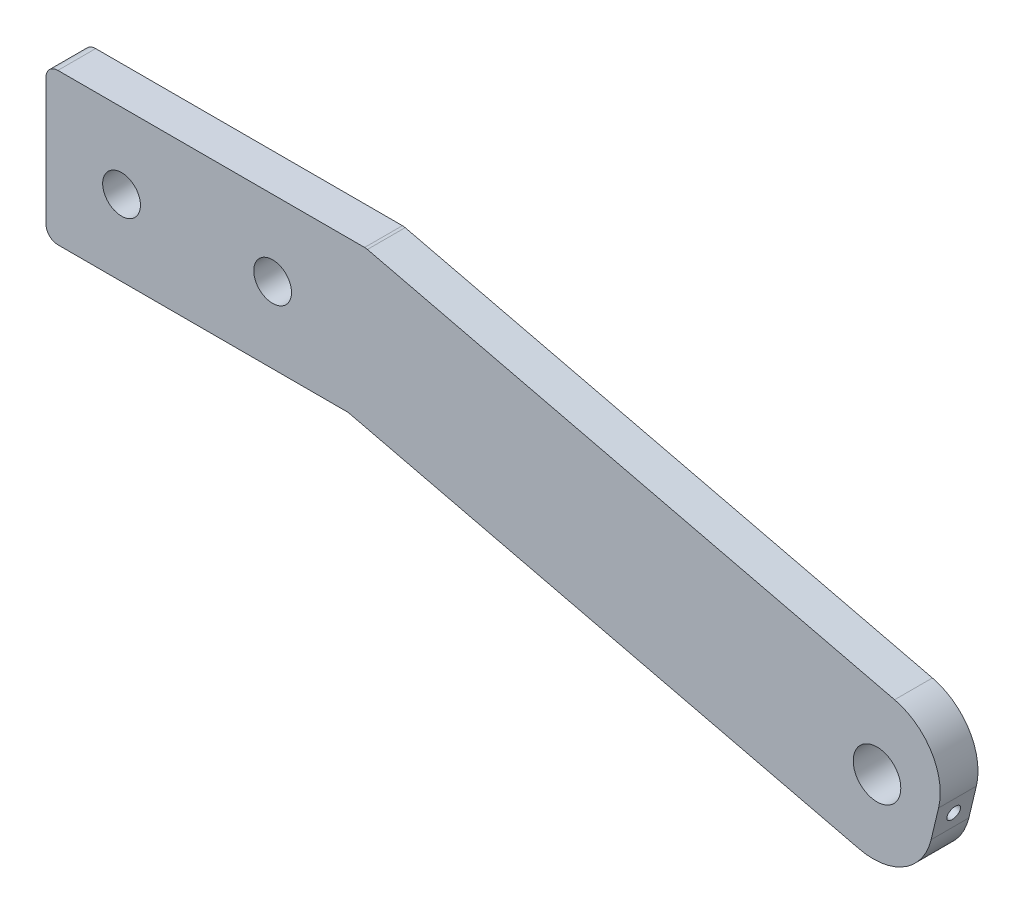
ISO-10303-21;
HEADER;
FILE_DESCRIPTION(('STEP AP214'),'2;1');
FILE_NAME('part.step','',(''),(''),'','','');
FILE_SCHEMA(('AUTOMOTIVE_DESIGN { 1 0 10303 214 1 1 1 1 }'));
ENDSEC;
DATA;
#1=APPLICATION_CONTEXT('core data for automotive mechanical design processes');
#2=APPLICATION_PROTOCOL_DEFINITION('international standard','automotive_design',2000,#1);
#3=PRODUCT_CONTEXT('',#1,'mechanical');
#4=PRODUCT('Part','Part','',(#3));
#5=PRODUCT_RELATED_PRODUCT_CATEGORY('part','',(#4));
#6=PRODUCT_DEFINITION_FORMATION('','',#4);
#7=PRODUCT_DEFINITION_CONTEXT('part definition',#1,'design');
#8=PRODUCT_DEFINITION('design','',#6,#7);
#9=PRODUCT_DEFINITION_SHAPE('','',#8);
#10=(LENGTH_UNIT() NAMED_UNIT(*) SI_UNIT(.MILLI.,.METRE.));
#11=(NAMED_UNIT(*) PLANE_ANGLE_UNIT() SI_UNIT($,.RADIAN.));
#12=(NAMED_UNIT(*) SI_UNIT($,.STERADIAN.) SOLID_ANGLE_UNIT());
#13=UNCERTAINTY_MEASURE_WITH_UNIT(LENGTH_MEASURE(1.E-05),#10,'distance_accuracy_value','');
#14=(GEOMETRIC_REPRESENTATION_CONTEXT(3) GLOBAL_UNCERTAINTY_ASSIGNED_CONTEXT((#13)) GLOBAL_UNIT_ASSIGNED_CONTEXT((#10,
#11,#12)) REPRESENTATION_CONTEXT('',''));
#15=CARTESIAN_POINT('',(0.,0.,0.));
#16=DIRECTION('',(0.,0.,1.));
#17=DIRECTION('',(1.,0.,0.));
#18=AXIS2_PLACEMENT_3D('',#15,#16,#17);
#19=CARTESIAN_POINT('',(0.,0.,6.35));
#20=DIRECTION('',(0.,0.,-1.));
#21=DIRECTION('',(-1.,0.,0.));
#22=AXIS2_PLACEMENT_3D('',#19,#20,#21);
#23=PLANE('',#22);
#24=DIRECTION('',(0.972452386669659,-0.233101599437848,0.));
#25=VECTOR('',#24,1.);
#26=CARTESIAN_POINT('',(12.7,-12.7,6.35));
#27=LINE('',#26,#25);
#28=CARTESIAN_POINT('',(12.9298460619296,-12.7550952266607,6.35));
#29=VERTEX_POINT('',#28);
#30=CARTESIAN_POINT('',(98.6396096871393,-33.3001453107047,6.35));
#31=VERTEX_POINT('',#30);
#32=EDGE_CURVE('E140',#29,#31,#27,.T.);
#33=ORIENTED_EDGE('',*,*,#32,.T.);
#34=CARTESIAN_POINT('',(100.970625681518,-23.5756214440081,6.35));
#35=DIRECTION('',(0.,0.,-1.));
#36=DIRECTION('',(-1.,0.,0.));
#37=AXIS2_PLACEMENT_3D('',#34,#35,#36);
#38=CIRCLE('',#37,10.);
#39=CARTESIAN_POINT('',(110.695149548214,-25.9066374383866,6.35));
#40=VERTEX_POINT('',#39);
#41=EDGE_CURVE('E41',#31,#40,#38,.F.);
#42=ORIENTED_EDGE('',*,*,#41,.T.);
#43=DIRECTION('',(0.233101599437848,0.97245238666966,0.));
#44=VECTOR('',#43,1.);
#45=CARTESIAN_POINT('',(108.364133553836,-35.6311613050832,6.35));
#46=LINE('',#45,#44);
#47=CARTESIAN_POINT('',(111.953898185179,-20.6553945503704,6.35));
#48=VERTEX_POINT('',#47);
#49=EDGE_CURVE('E147',#40,#48,#46,.T.);
#50=ORIENTED_EDGE('',*,*,#49,.T.);
#51=CARTESIAN_POINT('',(102.229374318482,-18.3243785559919,6.35));
#52=DIRECTION('',(0.,0.,-1.));
#53=DIRECTION('',(-1.,0.,0.));
#54=AXIS2_PLACEMENT_3D('',#51,#52,#53);
#55=CIRCLE('',#54,10.);
#56=CARTESIAN_POINT('',(104.560390312861,-8.5998546892953,6.35));
#57=VERTEX_POINT('',#56);
#58=EDGE_CURVE('E48',#48,#57,#55,.F.);
#59=ORIENTED_EDGE('',*,*,#58,.T.);
#60=DIRECTION('',(-0.972452386669659,0.233101599437848,0.));
#61=VECTOR('',#60,1.);
#62=CARTESIAN_POINT('',(15.7017356392152,12.7,6.35));
#63=LINE('',#62,#61);
#64=CARTESIAN_POINT('',(15.9315817011448,12.6449047733393,6.35));
#65=VERTEX_POINT('',#64);
#66=EDGE_CURVE('E150',#57,#65,#63,.T.);
#67=ORIENTED_EDGE('',*,*,#66,.T.);
#68=CARTESIAN_POINT('',(15.4653785022691,10.7,6.35));
#69=DIRECTION('',(0.,0.,-1.));
#70=DIRECTION('',(-1.,0.,0.));
#71=AXIS2_PLACEMENT_3D('',#68,#69,#70);
#72=CIRCLE('',#71,2.);
#73=CARTESIAN_POINT('',(15.4653785022691,12.7,6.35));
#74=VERTEX_POINT('',#73);
#75=EDGE_CURVE('E178',#65,#74,#72,.F.);
#76=ORIENTED_EDGE('',*,*,#75,.T.);
#77=DIRECTION('',(-1.,0.,0.));
#78=VECTOR('',#77,1.);
#79=CARTESIAN_POINT('',(15.7017356392152,12.7,6.35));
#80=LINE('',#79,#78);
#81=CARTESIAN_POINT('',(-36.1,12.7,6.35));
#82=VERTEX_POINT('',#81);
#83=EDGE_CURVE('E268',#74,#82,#80,.T.);
#84=ORIENTED_EDGE('',*,*,#83,.T.);
#85=CARTESIAN_POINT('',(-36.1,10.7,6.35));
#86=DIRECTION('',(0.,0.,-1.));
#87=DIRECTION('',(-1.,0.,0.));
#88=AXIS2_PLACEMENT_3D('',#85,#86,#87);
#89=CIRCLE('',#88,2.);
#90=CARTESIAN_POINT('',(-38.1,10.7,6.35));
#91=VERTEX_POINT('',#90);
#92=EDGE_CURVE('E174',#82,#91,#89,.F.);
#93=ORIENTED_EDGE('',*,*,#92,.T.);
#94=DIRECTION('',(0.,-1.,0.));
#95=VECTOR('',#94,1.);
#96=CARTESIAN_POINT('',(-38.1,-12.7,6.35));
#97=LINE('',#96,#95);
#98=CARTESIAN_POINT('',(-38.1,-10.7,6.35));
#99=VERTEX_POINT('',#98);
#100=EDGE_CURVE('E265',#91,#99,#97,.T.);
#101=ORIENTED_EDGE('',*,*,#100,.T.);
#102=CARTESIAN_POINT('',(-36.1,-10.7,6.35));
#103=DIRECTION('',(0.,0.,-1.));
#104=DIRECTION('',(-1.,0.,0.));
#105=AXIS2_PLACEMENT_3D('',#102,#103,#104);
#106=CIRCLE('',#105,2.);
#107=CARTESIAN_POINT('',(-36.1,-12.7,6.35));
#108=VERTEX_POINT('',#107);
#109=EDGE_CURVE('E176',#99,#108,#106,.F.);
#110=ORIENTED_EDGE('',*,*,#109,.T.);
#111=DIRECTION('',(1.,0.,0.));
#112=VECTOR('',#111,1.);
#113=CARTESIAN_POINT('',(12.7,-12.7,6.35));
#114=LINE('',#113,#112);
#115=CARTESIAN_POINT('',(12.4636428630539,-12.7,6.35));
#116=VERTEX_POINT('',#115);
#117=EDGE_CURVE('E263',#108,#116,#114,.T.);
#118=ORIENTED_EDGE('',*,*,#117,.T.);
#119=CARTESIAN_POINT('',(12.4636428630539,-14.7,6.35));
#120=DIRECTION('',(0.,0.,-1.));
#121=DIRECTION('',(-1.,0.,0.));
#122=AXIS2_PLACEMENT_3D('',#119,#120,#121);
#123=CIRCLE('',#122,2.);
#124=EDGE_CURVE('E135',#116,#29,#123,.T.);
#125=ORIENTED_EDGE('',*,*,#124,.T.);
#126=EDGE_LOOP('',(#33,#42,#50,#59,#67,#76,#84,#93,#101,#110,#118,#125));
#127=FACE_BOUND('',#126,.T.);
#128=CARTESIAN_POINT('',(101.6,-20.95,6.35));
#129=DIRECTION('',(0.,0.,1.));
#130=DIRECTION('',(1.,0.,0.));
#131=AXIS2_PLACEMENT_3D('',#128,#129,#130);
#132=CIRCLE('',#131,4.00000000000001);
#133=CARTESIAN_POINT('',(105.6,-20.95,6.35));
#134=VERTEX_POINT('',#133);
#135=EDGE_CURVE('E275',#134,#134,#132,.T.);
#136=ORIENTED_EDGE('',*,*,#135,.F.);
#137=EDGE_LOOP('',(#136));
#138=FACE_BOUND('',#137,.T.);
#139=CARTESIAN_POINT('',(-25.4,0.,6.35));
#140=DIRECTION('',(0.,0.,1.));
#141=DIRECTION('',(1.,0.,0.));
#142=AXIS2_PLACEMENT_3D('',#139,#140,#141);
#143=CIRCLE('',#142,3.175);
#144=CARTESIAN_POINT('',(-22.225,0.,6.35));
#145=VERTEX_POINT('',#144);
#146=EDGE_CURVE('E294',#145,#145,#143,.T.);
#147=ORIENTED_EDGE('',*,*,#146,.F.);
#148=EDGE_LOOP('',(#147));
#149=FACE_BOUND('',#148,.T.);
#150=CARTESIAN_POINT('',(0.,0.,6.35));
#151=DIRECTION('',(0.,0.,1.));
#152=DIRECTION('',(1.,0.,0.));
#153=AXIS2_PLACEMENT_3D('',#150,#151,#152);
#154=CIRCLE('',#153,3.175);
#155=CARTESIAN_POINT('',(3.175,0.,6.35));
#156=VERTEX_POINT('',#155);
#157=EDGE_CURVE('E300',#156,#156,#154,.T.);
#158=ORIENTED_EDGE('',*,*,#157,.F.);
#159=EDGE_LOOP('',(#158));
#160=FACE_BOUND('',#159,.T.);
#161=ADVANCED_FACE('F33',(#127,#138,#149,#160),#23,.F.);
#162=CARTESIAN_POINT('',(0.,0.,0.));
#163=DIRECTION('',(0.,0.,-1.));
#164=DIRECTION('',(-1.,0.,0.));
#165=AXIS2_PLACEMENT_3D('',#162,#163,#164);
#166=PLANE('',#165);
#167=CARTESIAN_POINT('',(-25.4,0.,0.));
#168=DIRECTION('',(0.,0.,1.));
#169=DIRECTION('',(1.,0.,0.));
#170=AXIS2_PLACEMENT_3D('',#167,#168,#169);
#171=CIRCLE('',#170,3.175);
#172=CARTESIAN_POINT('',(-22.225,0.,0.));
#173=VERTEX_POINT('',#172);
#174=EDGE_CURVE('E297',#173,#173,#171,.T.);
#175=ORIENTED_EDGE('',*,*,#174,.T.);
#176=EDGE_LOOP('',(#175));
#177=FACE_BOUND('',#176,.T.);
#178=DIRECTION('',(0.233101599437848,0.97245238666966,0.));
#179=VECTOR('',#178,1.);
#180=CARTESIAN_POINT('',(108.364133553836,-35.6311613050832,0.));
#181=LINE('',#180,#179);
#182=CARTESIAN_POINT('',(110.695149548214,-25.9066374383866,0.));
#183=VERTEX_POINT('',#182);
#184=CARTESIAN_POINT('',(111.953898185179,-20.6553945503704,0.));
#185=VERTEX_POINT('',#184);
#186=EDGE_CURVE('E272',#183,#185,#181,.T.);
#187=ORIENTED_EDGE('',*,*,#186,.F.);
#188=CARTESIAN_POINT('',(100.970625681518,-23.5756214440081,0.));
#189=DIRECTION('',(0.,0.,-1.));
#190=DIRECTION('',(-1.,0.,0.));
#191=AXIS2_PLACEMENT_3D('',#188,#189,#190);
#192=CIRCLE('',#191,10.);
#193=CARTESIAN_POINT('',(98.6396096871393,-33.3001453107047,0.));
#194=VERTEX_POINT('',#193);
#195=EDGE_CURVE('E146',#183,#194,#192,.T.);
#196=ORIENTED_EDGE('',*,*,#195,.T.);
#197=DIRECTION('',(0.972452386669659,-0.233101599437848,0.));
#198=VECTOR('',#197,1.);
#199=CARTESIAN_POINT('',(12.7,-12.7,0.));
#200=LINE('',#199,#198);
#201=CARTESIAN_POINT('',(12.9298460619296,-12.7550952266607,0.));
#202=VERTEX_POINT('',#201);
#203=EDGE_CURVE('E139',#202,#194,#200,.T.);
#204=ORIENTED_EDGE('',*,*,#203,.F.);
#205=CARTESIAN_POINT('',(12.4636428630539,-14.7,0.));
#206=DIRECTION('',(0.,0.,-1.));
#207=DIRECTION('',(-1.,0.,0.));
#208=AXIS2_PLACEMENT_3D('',#205,#206,#207);
#209=CIRCLE('',#208,2.);
#210=CARTESIAN_POINT('',(12.4636428630539,-12.7,0.));
#211=VERTEX_POINT('',#210);
#212=EDGE_CURVE('E125',#202,#211,#209,.F.);
#213=ORIENTED_EDGE('',*,*,#212,.T.);
#214=DIRECTION('',(1.,0.,0.));
#215=VECTOR('',#214,1.);
#216=CARTESIAN_POINT('',(12.7,-12.7,0.));
#217=LINE('',#216,#215);
#218=CARTESIAN_POINT('',(-36.1,-12.7,0.));
#219=VERTEX_POINT('',#218);
#220=EDGE_CURVE('E148',#219,#211,#217,.T.);
#221=ORIENTED_EDGE('',*,*,#220,.F.);
#222=CARTESIAN_POINT('',(-36.1,-10.7,0.));
#223=DIRECTION('',(0.,0.,-1.));
#224=DIRECTION('',(-1.,0.,0.));
#225=AXIS2_PLACEMENT_3D('',#222,#223,#224);
#226=CIRCLE('',#225,2.);
#227=CARTESIAN_POINT('',(-38.1,-10.7,0.));
#228=VERTEX_POINT('',#227);
#229=EDGE_CURVE('E166',#219,#228,#226,.T.);
#230=ORIENTED_EDGE('',*,*,#229,.T.);
#231=DIRECTION('',(0.,-1.,0.));
#232=VECTOR('',#231,1.);
#233=CARTESIAN_POINT('',(-38.1,-12.7,0.));
#234=LINE('',#233,#232);
#235=CARTESIAN_POINT('',(-38.1,10.7,0.));
#236=VERTEX_POINT('',#235);
#237=EDGE_CURVE('E152',#236,#228,#234,.T.);
#238=ORIENTED_EDGE('',*,*,#237,.F.);
#239=CARTESIAN_POINT('',(-36.1,10.7,0.));
#240=DIRECTION('',(0.,0.,-1.));
#241=DIRECTION('',(-1.,0.,0.));
#242=AXIS2_PLACEMENT_3D('',#239,#240,#241);
#243=CIRCLE('',#242,2.);
#244=CARTESIAN_POINT('',(-36.1,12.7,0.));
#245=VERTEX_POINT('',#244);
#246=EDGE_CURVE('E164',#236,#245,#243,.T.);
#247=ORIENTED_EDGE('',*,*,#246,.T.);
#248=DIRECTION('',(-1.,0.,0.));
#249=VECTOR('',#248,1.);
#250=CARTESIAN_POINT('',(15.7017356392152,12.7,0.));
#251=LINE('',#250,#249);
#252=CARTESIAN_POINT('',(15.4653785022691,12.7,0.));
#253=VERTEX_POINT('',#252);
#254=EDGE_CURVE('E277',#253,#245,#251,.T.);
#255=ORIENTED_EDGE('',*,*,#254,.F.);
#256=CARTESIAN_POINT('',(15.4653785022691,10.7,0.));
#257=DIRECTION('',(0.,0.,-1.));
#258=DIRECTION('',(-1.,0.,0.));
#259=AXIS2_PLACEMENT_3D('',#256,#257,#258);
#260=CIRCLE('',#259,2.);
#261=CARTESIAN_POINT('',(15.9315817011448,12.6449047733393,0.));
#262=VERTEX_POINT('',#261);
#263=EDGE_CURVE('E168',#253,#262,#260,.T.);
#264=ORIENTED_EDGE('',*,*,#263,.T.);
#265=DIRECTION('',(-0.972452386669659,0.233101599437848,0.));
#266=VECTOR('',#265,1.);
#267=CARTESIAN_POINT('',(15.7017356392152,12.7,0.));
#268=LINE('',#267,#266);
#269=CARTESIAN_POINT('',(104.560390312861,-8.5998546892953,0.));
#270=VERTEX_POINT('',#269);
#271=EDGE_CURVE('E274',#270,#262,#268,.T.);
#272=ORIENTED_EDGE('',*,*,#271,.F.);
#273=CARTESIAN_POINT('',(102.229374318482,-18.3243785559919,0.));
#274=DIRECTION('',(0.,0.,-1.));
#275=DIRECTION('',(-1.,0.,0.));
#276=AXIS2_PLACEMENT_3D('',#273,#274,#275);
#277=CIRCLE('',#276,10.);
#278=EDGE_CURVE('E190',#270,#185,#277,.T.);
#279=ORIENTED_EDGE('',*,*,#278,.T.);
#280=EDGE_LOOP('',(#187,#196,#204,#213,#221,#230,#238,#247,#255,#264,#272,#279));
#281=FACE_BOUND('',#280,.T.);
#282=CARTESIAN_POINT('',(101.6,-20.95,0.));
#283=DIRECTION('',(0.,0.,1.));
#284=DIRECTION('',(1.,0.,0.));
#285=AXIS2_PLACEMENT_3D('',#282,#283,#284);
#286=CIRCLE('',#285,4.00000000000001);
#287=CARTESIAN_POINT('',(105.6,-20.95,0.));
#288=VERTEX_POINT('',#287);
#289=EDGE_CURVE('E291',#288,#288,#286,.T.);
#290=ORIENTED_EDGE('',*,*,#289,.T.);
#291=EDGE_LOOP('',(#290));
#292=FACE_BOUND('',#291,.T.);
#293=CARTESIAN_POINT('',(0.,0.,0.));
#294=DIRECTION('',(0.,0.,1.));
#295=DIRECTION('',(1.,0.,0.));
#296=AXIS2_PLACEMENT_3D('',#293,#294,#295);
#297=CIRCLE('',#296,3.175);
#298=CARTESIAN_POINT('',(3.175,0.,0.));
#299=VERTEX_POINT('',#298);
#300=EDGE_CURVE('E303',#299,#299,#297,.T.);
#301=ORIENTED_EDGE('',*,*,#300,.T.);
#302=EDGE_LOOP('',(#301));
#303=FACE_BOUND('',#302,.T.);
#304=ADVANCED_FACE('F144',(#177,#281,#292,#303),#166,.T.);
#305=CARTESIAN_POINT('',(108.364133553836,-35.6311613050832,6.35));
#306=DIRECTION('',(-0.972452386669659,0.233101599437848,0.));
#307=DIRECTION('',(-0.233101599437848,-0.972452386669659,0.));
#308=AXIS2_PLACEMENT_3D('',#305,#306,#307);
#309=PLANE('',#308);
#310=CARTESIAN_POINT('',(111.324523866697,-23.2810159943785,3.175));
#311=DIRECTION('',(0.972452386669659,-0.233101599437848,0.));
#312=DIRECTION('',(0.233101599437848,0.972452386669659,0.));
#313=AXIS2_PLACEMENT_3D('',#310,#311,#312);
#314=CIRCLE('',#313,1.1303);
#315=CARTESIAN_POINT('',(111.587998604541,-22.1818530617258,3.175));
#316=VERTEX_POINT('',#315);
#317=EDGE_CURVE('E306',#316,#316,#314,.T.);
#318=ORIENTED_EDGE('',*,*,#317,.F.);
#319=EDGE_LOOP('',(#318));
#320=FACE_BOUND('',#319,.T.);
#321=ORIENTED_EDGE('',*,*,#49,.F.);
#322=DIRECTION('',(0.,0.,-1.));
#323=VECTOR('',#322,1.);
#324=CARTESIAN_POINT('',(110.695149548214,-25.9066374383866,6.35));
#325=LINE('',#324,#323);
#326=EDGE_CURVE('E187',#40,#183,#325,.T.);
#327=ORIENTED_EDGE('',*,*,#326,.T.);
#328=ORIENTED_EDGE('',*,*,#186,.T.);
#329=DIRECTION('',(0.,0.,-1.));
#330=VECTOR('',#329,1.);
#331=CARTESIAN_POINT('',(111.953898185179,-20.6553945503704,6.35));
#332=LINE('',#331,#330);
#333=EDGE_CURVE('E185',#185,#48,#332,.F.);
#334=ORIENTED_EDGE('',*,*,#333,.T.);
#335=EDGE_LOOP('',(#321,#327,#328,#334));
#336=FACE_BOUND('',#335,.T.);
#337=ADVANCED_FACE('F200',(#320,#336),#309,.F.);
#338=CARTESIAN_POINT('',(15.7017356392152,12.7,6.35));
#339=DIRECTION('',(-0.233101599437848,-0.972452386669659,0.));
#340=DIRECTION('',(0.97245238666966,-0.233101599437848,0.));
#341=AXIS2_PLACEMENT_3D('',#338,#339,#340);
#342=PLANE('',#341);
#343=ORIENTED_EDGE('',*,*,#66,.F.);
#344=DIRECTION('',(0.,0.,-1.));
#345=VECTOR('',#344,1.);
#346=CARTESIAN_POINT('',(104.560390312861,-8.5998546892953,6.35));
#347=LINE('',#346,#345);
#348=EDGE_CURVE('E11',#57,#270,#347,.T.);
#349=ORIENTED_EDGE('',*,*,#348,.T.);
#350=ORIENTED_EDGE('',*,*,#271,.T.);
#351=DIRECTION('',(0.,0.,-1.));
#352=VECTOR('',#351,1.);
#353=CARTESIAN_POINT('',(15.9315817011448,12.6449047733393,6.35));
#354=LINE('',#353,#352);
#355=EDGE_CURVE('E171',#262,#65,#354,.F.);
#356=ORIENTED_EDGE('',*,*,#355,.T.);
#357=EDGE_LOOP('',(#343,#349,#350,#356));
#358=FACE_BOUND('',#357,.T.);
#359=ADVANCED_FACE('F238',(#358),#342,.F.);
#360=CARTESIAN_POINT('',(15.7017356392152,12.7,6.35));
#361=DIRECTION('',(0.,-1.,0.));
#362=DIRECTION('',(1.,0.,0.));
#363=AXIS2_PLACEMENT_3D('',#360,#361,#362);
#364=PLANE('',#363);
#365=ORIENTED_EDGE('',*,*,#83,.F.);
#366=DIRECTION('',(0.,0.,-1.));
#367=VECTOR('',#366,1.);
#368=CARTESIAN_POINT('',(15.4653785022691,12.7,6.35));
#369=LINE('',#368,#367);
#370=EDGE_CURVE('E161',#74,#253,#369,.T.);
#371=ORIENTED_EDGE('',*,*,#370,.T.);
#372=ORIENTED_EDGE('',*,*,#254,.T.);
#373=DIRECTION('',(0.,0.,-1.));
#374=VECTOR('',#373,1.);
#375=CARTESIAN_POINT('',(-36.1,12.7,6.35));
#376=LINE('',#375,#374);
#377=EDGE_CURVE('E159',#245,#82,#376,.F.);
#378=ORIENTED_EDGE('',*,*,#377,.T.);
#379=EDGE_LOOP('',(#365,#371,#372,#378));
#380=FACE_BOUND('',#379,.T.);
#381=ADVANCED_FACE('F234',(#380),#364,.F.);
#382=CARTESIAN_POINT('',(-38.1,-12.7,6.35));
#383=DIRECTION('',(1.,0.,0.));
#384=DIRECTION('',(0.,0.,-1.));
#385=AXIS2_PLACEMENT_3D('',#382,#383,#384);
#386=PLANE('',#385);
#387=ORIENTED_EDGE('',*,*,#237,.T.);
#388=DIRECTION('',(0.,0.,-1.));
#389=VECTOR('',#388,1.);
#390=CARTESIAN_POINT('',(-38.1,-10.7,6.35));
#391=LINE('',#390,#389);
#392=EDGE_CURVE('E136',#228,#99,#391,.F.);
#393=ORIENTED_EDGE('',*,*,#392,.T.);
#394=ORIENTED_EDGE('',*,*,#100,.F.);
#395=DIRECTION('',(0.,0.,-1.));
#396=VECTOR('',#395,1.);
#397=CARTESIAN_POINT('',(-38.1,10.7,6.35));
#398=LINE('',#397,#396);
#399=EDGE_CURVE('E180',#91,#236,#398,.T.);
#400=ORIENTED_EDGE('',*,*,#399,.T.);
#401=EDGE_LOOP('',(#387,#393,#394,#400));
#402=FACE_BOUND('',#401,.T.);
#403=ADVANCED_FACE('F230',(#402),#386,.F.);
#404=CARTESIAN_POINT('',(12.7,-12.7,6.35));
#405=DIRECTION('',(0.,1.,0.));
#406=DIRECTION('',(-1.,0.,0.));
#407=AXIS2_PLACEMENT_3D('',#404,#405,#406);
#408=PLANE('',#407);
#409=ORIENTED_EDGE('',*,*,#220,.T.);
#410=DIRECTION('',(0.,0.,-1.));
#411=VECTOR('',#410,1.);
#412=CARTESIAN_POINT('',(12.4636428630539,-12.7,6.35));
#413=LINE('',#412,#411);
#414=EDGE_CURVE('E130',#211,#116,#413,.F.);
#415=ORIENTED_EDGE('',*,*,#414,.T.);
#416=ORIENTED_EDGE('',*,*,#117,.F.);
#417=DIRECTION('',(0.,0.,-1.));
#418=VECTOR('',#417,1.);
#419=CARTESIAN_POINT('',(-36.1,-12.7,6.35));
#420=LINE('',#419,#418);
#421=EDGE_CURVE('E141',#108,#219,#420,.T.);
#422=ORIENTED_EDGE('',*,*,#421,.T.);
#423=EDGE_LOOP('',(#409,#415,#416,#422));
#424=FACE_BOUND('',#423,.T.);
#425=ADVANCED_FACE('F227',(#424),#408,.F.);
#426=CARTESIAN_POINT('',(12.7,-12.7,6.35));
#427=DIRECTION('',(0.233101599437848,0.97245238666966,0.));
#428=DIRECTION('',(-0.97245238666966,0.233101599437848,0.));
#429=AXIS2_PLACEMENT_3D('',#426,#427,#428);
#430=PLANE('',#429);
#431=ORIENTED_EDGE('',*,*,#203,.T.);
#432=DIRECTION('',(0.,0.,-1.));
#433=VECTOR('',#432,1.);
#434=CARTESIAN_POINT('',(98.6396096871393,-33.3001453107047,6.35));
#435=LINE('',#434,#433);
#436=EDGE_CURVE('E56',#194,#31,#435,.F.);
#437=ORIENTED_EDGE('',*,*,#436,.T.);
#438=ORIENTED_EDGE('',*,*,#32,.F.);
#439=DIRECTION('',(0.,0.,-1.));
#440=VECTOR('',#439,1.);
#441=CARTESIAN_POINT('',(12.9298460619296,-12.7550952266607,0.));
#442=LINE('',#441,#440);
#443=EDGE_CURVE('E129',#29,#202,#442,.T.);
#444=ORIENTED_EDGE('',*,*,#443,.T.);
#445=EDGE_LOOP('',(#431,#437,#438,#444));
#446=FACE_BOUND('',#445,.T.);
#447=ADVANCED_FACE('F138',(#446),#430,.F.);
#448=CARTESIAN_POINT('',(101.6,-20.95,6.35));
#449=DIRECTION('',(0.,0.,-1.));
#450=DIRECTION('',(-1.,0.,0.));
#451=AXIS2_PLACEMENT_3D('',#448,#449,#450);
#452=CYLINDRICAL_SURFACE('',#451,4.00000000000001);
#453=CARTESIAN_POINT('',(105.594755906145,-20.7452434364466,3.175));
#454=CARTESIAN_POINT('',(105.594756514688,-20.7452448037348,3.23711372815392));
#455=CARTESIAN_POINT('',(105.595041112031,-20.750594803155,3.29923954462562));
#456=CARTESIAN_POINT('',(105.596041153498,-20.7717754541651,3.42168671853409));
#457=CARTESIAN_POINT('',(105.596756779677,-20.7876105346594,3.48200730218087));
#458=CARTESIAN_POINT('',(105.598225933012,-20.8291026222887,3.5990545029817));
#459=CARTESIAN_POINT('',(105.598979400884,-20.8547446585494,3.65578644531423));
#460=CARTESIAN_POINT('',(105.59995922102,-20.9149444714095,3.76430253358386));
#461=CARTESIAN_POINT('',(105.600185514254,-20.9495032459511,3.81608612482261));
#462=CARTESIAN_POINT('',(105.599444566683,-21.0274339364745,3.91468945323319));
#463=CARTESIAN_POINT('',(105.598446861735,-21.0710074242587,3.96134968479979));
#464=CARTESIAN_POINT('',(105.594489874456,-21.1650912679575,4.04696683188998));
#465=CARTESIAN_POINT('',(105.591530367213,-21.2156024187126,4.08592286350243));
#466=CARTESIAN_POINT('',(105.582933663313,-21.3230870185405,4.15570363256051));
#467=CARTESIAN_POINT('',(105.577248829967,-21.3801611396259,4.18636791111128));
#468=CARTESIAN_POINT('',(105.5626912949,-21.498281917821,4.23764503052909));
#469=CARTESIAN_POINT('',(105.553819200225,-21.5593278166533,4.25825978366995));
#470=CARTESIAN_POINT('',(105.532948913398,-21.6818997434694,4.28833106320461));
#471=CARTESIAN_POINT('',(105.521036432702,-21.7433736050195,4.2980593602554));
#472=CARTESIAN_POINT('',(105.494119555027,-21.8664032484297,4.30693861015676));
#473=CARTESIAN_POINT('',(105.479115737137,-21.9279590128046,4.30609154228602));
#474=CARTESIAN_POINT('',(105.446954353631,-22.0475755928286,4.2940313447407));
#475=CARTESIAN_POINT('',(105.429869723732,-22.1056860160085,4.28311214290585));
#476=CARTESIAN_POINT('',(105.393938820406,-22.2186784951625,4.25169492574781));
#477=CARTESIAN_POINT('',(105.375092440886,-22.2735603563876,4.23119633325501));
#478=CARTESIAN_POINT('',(105.336340428917,-22.3793247980597,4.18098928170668));
#479=CARTESIAN_POINT('',(105.316425572436,-22.4301579250884,4.15118398425996));
#480=CARTESIAN_POINT('',(105.276791707388,-22.5260387726938,4.08328490579975));
#481=CARTESIAN_POINT('',(105.257072741912,-22.571085245282,4.04518934160868));
#482=CARTESIAN_POINT('',(105.218308907267,-22.6558990543721,3.96024709838253));
#483=CARTESIAN_POINT('',(105.199310466867,-22.6954318735083,3.91314474808012));
#484=CARTESIAN_POINT('',(105.163995549803,-22.7664562371411,3.81232521005738));
#485=CARTESIAN_POINT('',(105.147679281028,-22.7979471584319,3.75860751015933));
#486=CARTESIAN_POINT('',(105.118805174291,-22.852359171085,3.64551320522094));
#487=CARTESIAN_POINT('',(105.106277081613,-22.8752127735587,3.58609640689279));
#488=CARTESIAN_POINT('',(105.08617369406,-22.9113837016121,3.46363524335901));
#489=CARTESIAN_POINT('',(105.078596994769,-22.9247037314021,3.40059191230995));
#490=CARTESIAN_POINT('',(105.069217405298,-22.9411347827603,3.274919846487));
#491=CARTESIAN_POINT('',(105.067230440186,-22.9445713632737,3.21234736384443));
#492=CARTESIAN_POINT('',(105.068671965706,-22.942063538483,3.08745859327182));
#493=CARTESIAN_POINT('',(105.072099797975,-22.9361202736382,3.02514227511933));
#494=CARTESIAN_POINT('',(105.083942100436,-22.9152695258045,2.90397208572161));
#495=CARTESIAN_POINT('',(105.092243880481,-22.9005645116173,2.84507202008121));
#496=CARTESIAN_POINT('',(105.113097387747,-22.8627493145555,2.73083295295429));
#497=CARTESIAN_POINT('',(105.125649718665,-22.839637937709,2.67549445863935));
#498=CARTESIAN_POINT('',(105.154454471913,-22.7848922376243,2.56846474448139));
#499=CARTESIAN_POINT('',(105.170789345265,-22.753064571577,2.5168947294188));
#500=CARTESIAN_POINT('',(105.20586586851,-22.6818498463105,2.4201876105872));
#501=CARTESIAN_POINT('',(105.224608028075,-22.6424611853925,2.37505187337337));
#502=CARTESIAN_POINT('',(105.263966996011,-22.5555194420151,2.29096531809175));
#503=CARTESIAN_POINT('',(105.284625216879,-22.5077401825652,2.25226717156375));
#504=CARTESIAN_POINT('',(105.325980721527,-22.4060480692528,2.18402395836973));
#505=CARTESIAN_POINT('',(105.346678003193,-22.3521355382799,2.15447841016448));
#506=CARTESIAN_POINT('',(105.386764534888,-22.2399350020793,2.10565983065959));
#507=CARTESIAN_POINT('',(105.406162669571,-22.1816840949706,2.0863090559791));
#508=CARTESIAN_POINT('',(105.4428213995,-22.0620400172536,2.05821412396092));
#509=CARTESIAN_POINT('',(105.460082530613,-22.0006476398676,2.04946730276015));
#510=CARTESIAN_POINT('',(105.491190229498,-21.8786894390104,2.04301225405897));
#511=CARTESIAN_POINT('',(105.505133661047,-21.8181675709229,2.0449354508621));
#512=CARTESIAN_POINT('',(105.5299829917,-21.6976749455243,2.05889832229464));
#513=CARTESIAN_POINT('',(105.540889030727,-21.6377041629494,2.07093753080828));
#514=CARTESIAN_POINT('',(105.55953717129,-21.5205748296191,2.10457254114808));
#515=CARTESIAN_POINT('',(105.567305601346,-21.4633965738546,2.12608551097358));
#516=CARTESIAN_POINT('',(105.580047694889,-21.3528869993989,2.17798370573449));
#517=CARTESIAN_POINT('',(105.585020931685,-21.2995562691241,2.20837028417184));
#518=CARTESIAN_POINT('',(105.592728718252,-21.1966927408138,2.27818632675747));
#519=CARTESIAN_POINT('',(105.595393572081,-21.1473165491379,2.31785418117005));
#520=CARTESIAN_POINT('',(105.598871451747,-21.055547663434,2.40466532241355));
#521=CARTESIAN_POINT('',(105.599683969448,-21.0131568886145,2.45181065668607));
#522=CARTESIAN_POINT('',(105.600167194586,-20.9356538169672,2.55368500090855));
#523=CARTESIAN_POINT('',(105.599808224108,-20.900754952542,2.60857688454948));
#524=CARTESIAN_POINT('',(105.59862406815,-20.8408756230978,2.72350589295951));
#525=CARTESIAN_POINT('',(105.5977991519,-20.8158894445698,2.78354002948333));
#526=CARTESIAN_POINT('',(105.596399758422,-20.7794938067301,2.89851693538745));
#527=CARTESIAN_POINT('',(105.595806433673,-20.7666875779435,2.95302070659744));
#528=CARTESIAN_POINT('',(105.594984261309,-20.7495624133854,3.06334652864946));
#529=CARTESIAN_POINT('',(105.59475535915,-20.7452422074443,3.11916838093795));
#530=CARTESIAN_POINT('',(105.594755906145,-20.7452434364466,3.175));
#531=B_SPLINE_CURVE_WITH_KNOTS('',3,(#453,#454,#455,#456,#457,#458,#459,#460,#461,#462,#463,
#464,#465,#466,#467,#468,#469,#470,#471,#472,#473,#474,#475,#476,#477,#478,#479,#480,#481,#482,
#483,#484,#485,#486,#487,#488,#489,#490,#491,#492,#493,#494,#495,#496,#497,#498,#499,#500,#501,
#502,#503,#504,#505,#506,#507,#508,#509,#510,#511,#512,#513,#514,#515,#516,#517,#518,#519,#520,
#521,#522,#523,#524,#525,#526,#527,#528,#529,#530),.UNSPECIFIED.,.T.,.F.,(4,2,2,2,2,2,2,2,2,2,2,
2,2,2,2,2,2,2,2,2,2,2,2,2,2,2,2,2,2,2,2,2,2,2,2,2,2,2,4),(0.,0.186135589509668,
0.372349853000611,0.558280977223397,0.744232919492104,0.934908408617409,1.12560576147091,
1.31976512856389,1.51388753560898,1.70304751535099,1.89217209256027,2.07594644403613,
2.25973186956171,2.44549720530417,2.63130253741552,2.82349089718013,3.01569414603705,
3.20936959200039,3.4029900798797,3.59015533205527,3.7772978292814,3.96027493252019,
4.14327803450554,4.33072519990161,4.51821211746174,4.71187415927933,4.90552601036089,
5.09767891516587,5.28978353843416,5.4752945105866,5.6607969354136,5.84470869666109,
6.02864852485081,6.21796564305166,6.40733468878239,6.60153799259508,6.79562919762533,
6.96296430175573,7.13027435762039),.UNSPECIFIED.);
#532=CARTESIAN_POINT('',(105.594755906145,-20.7452434364466,3.175));
#533=VERTEX_POINT('',#532);
#534=EDGE_CURVE('E311',#533,#533,#531,.T.);
#535=ORIENTED_EDGE('',*,*,#534,.T.);
#536=EDGE_LOOP('',(#535));
#537=FACE_BOUND('',#536,.T.);
#538=ORIENTED_EDGE('',*,*,#135,.T.);
#539=EDGE_LOOP('',(#538));
#540=FACE_BOUND('',#539,.T.);
#541=ORIENTED_EDGE('',*,*,#289,.F.);
#542=EDGE_LOOP('',(#541));
#543=FACE_BOUND('',#542,.T.);
#544=ADVANCED_FACE('F222',(#537,#540,#543),#452,.F.);
#545=CARTESIAN_POINT('',(-25.4,0.,6.35));
#546=DIRECTION('',(0.,0.,-1.));
#547=DIRECTION('',(-1.,0.,0.));
#548=AXIS2_PLACEMENT_3D('',#545,#546,#547);
#549=CYLINDRICAL_SURFACE('',#548,3.175);
#550=ORIENTED_EDGE('',*,*,#146,.T.);
#551=EDGE_LOOP('',(#550));
#552=FACE_BOUND('',#551,.T.);
#553=ORIENTED_EDGE('',*,*,#174,.F.);
#554=EDGE_LOOP('',(#553));
#555=FACE_BOUND('',#554,.T.);
#556=ADVANCED_FACE('F323',(#552,#555),#549,.F.);
#557=CARTESIAN_POINT('',(0.,0.,6.35));
#558=DIRECTION('',(0.,0.,-1.));
#559=DIRECTION('',(-1.,0.,0.));
#560=AXIS2_PLACEMENT_3D('',#557,#558,#559);
#561=CYLINDRICAL_SURFACE('',#560,3.175);
#562=ORIENTED_EDGE('',*,*,#157,.T.);
#563=EDGE_LOOP('',(#562));
#564=FACE_BOUND('',#563,.T.);
#565=ORIENTED_EDGE('',*,*,#300,.F.);
#566=EDGE_LOOP('',(#565));
#567=FACE_BOUND('',#566,.T.);
#568=ADVANCED_FACE('F321',(#564,#567),#561,.F.);
#569=CARTESIAN_POINT('',(-38.138172413868,12.5459242619037,3.175));
#570=DIRECTION('',(0.97245238666966,-0.233101599437848,0.));
#571=DIRECTION('',(0.233101599437848,0.97245238666966,0.));
#572=AXIS2_PLACEMENT_3D('',#569,#570,#571);
#573=CYLINDRICAL_SURFACE('',#572,1.1303);
#574=ORIENTED_EDGE('',*,*,#534,.F.);
#575=EDGE_LOOP('',(#574));
#576=FACE_BOUND('',#575,.T.);
#577=ORIENTED_EDGE('',*,*,#317,.T.);
#578=EDGE_LOOP('',(#577));
#579=FACE_BOUND('',#578,.T.);
#580=ADVANCED_FACE('F249',(#576,#579),#573,.F.);
#581=CARTESIAN_POINT('',(12.4636428630539,-14.7,6.35));
#582=DIRECTION('',(0.,0.,1.));
#583=DIRECTION('',(1.,0.,0.));
#584=AXIS2_PLACEMENT_3D('',#581,#582,#583);
#585=CYLINDRICAL_SURFACE('',#584,2.);
#586=ORIENTED_EDGE('',*,*,#124,.F.);
#587=ORIENTED_EDGE('',*,*,#414,.F.);
#588=ORIENTED_EDGE('',*,*,#212,.F.);
#589=ORIENTED_EDGE('',*,*,#443,.F.);
#590=EDGE_LOOP('',(#586,#587,#588,#589));
#591=FACE_BOUND('',#590,.T.);
#592=ADVANCED_FACE('F128',(#591),#585,.F.);
#593=CARTESIAN_POINT('',(15.4653785022691,10.7,6.35));
#594=DIRECTION('',(0.,0.,-1.));
#595=DIRECTION('',(-1.,0.,0.));
#596=AXIS2_PLACEMENT_3D('',#593,#594,#595);
#597=CYLINDRICAL_SURFACE('',#596,2.);
#598=ORIENTED_EDGE('',*,*,#75,.F.);
#599=ORIENTED_EDGE('',*,*,#355,.F.);
#600=ORIENTED_EDGE('',*,*,#263,.F.);
#601=ORIENTED_EDGE('',*,*,#370,.F.);
#602=EDGE_LOOP('',(#598,#599,#600,#601));
#603=FACE_BOUND('',#602,.T.);
#604=ADVANCED_FACE('F248',(#603),#597,.T.);
#605=CARTESIAN_POINT('',(-36.1,-10.7,6.35));
#606=DIRECTION('',(0.,0.,-1.));
#607=DIRECTION('',(-1.,0.,0.));
#608=AXIS2_PLACEMENT_3D('',#605,#606,#607);
#609=CYLINDRICAL_SURFACE('',#608,2.);
#610=ORIENTED_EDGE('',*,*,#109,.F.);
#611=ORIENTED_EDGE('',*,*,#392,.F.);
#612=ORIENTED_EDGE('',*,*,#229,.F.);
#613=ORIENTED_EDGE('',*,*,#421,.F.);
#614=EDGE_LOOP('',(#610,#611,#612,#613));
#615=FACE_BOUND('',#614,.T.);
#616=ADVANCED_FACE('F211',(#615),#609,.T.);
#617=CARTESIAN_POINT('',(-36.1,10.7,6.35));
#618=DIRECTION('',(0.,0.,-1.));
#619=DIRECTION('',(-1.,0.,0.));
#620=AXIS2_PLACEMENT_3D('',#617,#618,#619);
#621=CYLINDRICAL_SURFACE('',#620,2.);
#622=ORIENTED_EDGE('',*,*,#92,.F.);
#623=ORIENTED_EDGE('',*,*,#377,.F.);
#624=ORIENTED_EDGE('',*,*,#246,.F.);
#625=ORIENTED_EDGE('',*,*,#399,.F.);
#626=EDGE_LOOP('',(#622,#623,#624,#625));
#627=FACE_BOUND('',#626,.T.);
#628=ADVANCED_FACE('F205',(#627),#621,.T.);
#629=CARTESIAN_POINT('',(100.970625681518,-23.5756214440081,6.35));
#630=DIRECTION('',(0.,0.,-1.));
#631=DIRECTION('',(-1.,0.,0.));
#632=AXIS2_PLACEMENT_3D('',#629,#630,#631);
#633=CYLINDRICAL_SURFACE('',#632,10.);
#634=ORIENTED_EDGE('',*,*,#41,.F.);
#635=ORIENTED_EDGE('',*,*,#436,.F.);
#636=ORIENTED_EDGE('',*,*,#195,.F.);
#637=ORIENTED_EDGE('',*,*,#326,.F.);
#638=EDGE_LOOP('',(#634,#635,#636,#637));
#639=FACE_BOUND('',#638,.T.);
#640=ADVANCED_FACE('F203',(#639),#633,.T.);
#641=CARTESIAN_POINT('',(102.229374318482,-18.3243785559919,6.35));
#642=DIRECTION('',(0.,0.,-1.));
#643=DIRECTION('',(-1.,0.,0.));
#644=AXIS2_PLACEMENT_3D('',#641,#642,#643);
#645=CYLINDRICAL_SURFACE('',#644,10.);
#646=ORIENTED_EDGE('',*,*,#58,.F.);
#647=ORIENTED_EDGE('',*,*,#333,.F.);
#648=ORIENTED_EDGE('',*,*,#278,.F.);
#649=ORIENTED_EDGE('',*,*,#348,.F.);
#650=EDGE_LOOP('',(#646,#647,#648,#649));
#651=FACE_BOUND('',#650,.T.);
#652=ADVANCED_FACE('F35',(#651),#645,.T.);
#653=CLOSED_SHELL('',(#161,#304,#337,#359,#381,#403,#425,#447,#544,#556,#568,#580,#592,#604,
#616,#628,#640,#652));
#654=MANIFOLD_SOLID_BREP('B2',#653);
#655=ADVANCED_BREP_SHAPE_REPRESENTATION('',(#18,#654),#14);
#656=SHAPE_DEFINITION_REPRESENTATION(#9,#655);
ENDSEC;
END-ISO-10303-21;
